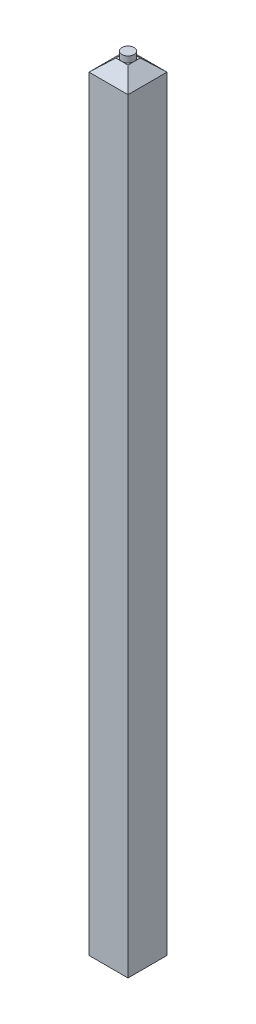
ISO-10303-21;
HEADER;
FILE_DESCRIPTION(('STEP AP214'),'2;1');
FILE_NAME('part.step','',(''),(''),'','','');
FILE_SCHEMA(('AUTOMOTIVE_DESIGN { 1 0 10303 214 1 1 1 1 }'));
ENDSEC;
DATA;
#1=APPLICATION_CONTEXT('core data for automotive mechanical design processes');
#2=APPLICATION_PROTOCOL_DEFINITION('international standard','automotive_design',2000,#1);
#3=PRODUCT_CONTEXT('',#1,'mechanical');
#4=PRODUCT('Part','Part','',(#3));
#5=PRODUCT_RELATED_PRODUCT_CATEGORY('part','',(#4));
#6=PRODUCT_DEFINITION_FORMATION('','',#4);
#7=PRODUCT_DEFINITION_CONTEXT('part definition',#1,'design');
#8=PRODUCT_DEFINITION('design','',#6,#7);
#9=PRODUCT_DEFINITION_SHAPE('','',#8);
#10=(LENGTH_UNIT() NAMED_UNIT(*) SI_UNIT(.MILLI.,.METRE.));
#11=(NAMED_UNIT(*) PLANE_ANGLE_UNIT() SI_UNIT($,.RADIAN.));
#12=(NAMED_UNIT(*) SI_UNIT($,.STERADIAN.) SOLID_ANGLE_UNIT());
#13=UNCERTAINTY_MEASURE_WITH_UNIT(LENGTH_MEASURE(1.E-05),#10,'distance_accuracy_value','');
#14=(GEOMETRIC_REPRESENTATION_CONTEXT(3) GLOBAL_UNCERTAINTY_ASSIGNED_CONTEXT((#13)) GLOBAL_UNIT_ASSIGNED_CONTEXT((#10,
#11,#12)) REPRESENTATION_CONTEXT('',''));
#15=CARTESIAN_POINT('',(0.,0.,0.));
#16=DIRECTION('',(0.,0.,1.));
#17=DIRECTION('',(1.,0.,0.));
#18=AXIS2_PLACEMENT_3D('',#15,#16,#17);
#19=CARTESIAN_POINT('',(0.,12.74,0.));
#20=DIRECTION('',(0.,-1.,0.));
#21=DIRECTION('',(0.,0.,-1.));
#22=AXIS2_PLACEMENT_3D('',#19,#20,#21);
#23=PLANE('',#22);
#24=CARTESIAN_POINT('',(0.,12.74,0.));
#25=DIRECTION('',(0.,1.,0.));
#26=DIRECTION('',(0.,0.,1.));
#27=AXIS2_PLACEMENT_3D('',#24,#25,#26);
#28=CIRCLE('',#27,0.1);
#29=CARTESIAN_POINT('',(0.,12.74,0.1));
#30=VERTEX_POINT('',#29);
#31=CARTESIAN_POINT('',(0.0999999999999997,12.74,0.));
#32=VERTEX_POINT('',#31);
#33=EDGE_CURVE('E163',#30,#32,#28,.T.);
#34=ORIENTED_EDGE('',*,*,#33,.F.);
#35=DIRECTION('',(1.,0.,0.));
#36=VECTOR('',#35,1.);
#37=CARTESIAN_POINT('',(0.1,12.74,0.1));
#38=LINE('',#37,#36);
#39=CARTESIAN_POINT('',(0.1,12.74,0.1));
#40=VERTEX_POINT('',#39);
#41=EDGE_CURVE('E143',#30,#40,#38,.T.);
#42=ORIENTED_EDGE('',*,*,#41,.T.);
#43=DIRECTION('',(0.,0.,-1.));
#44=VECTOR('',#43,1.);
#45=CARTESIAN_POINT('',(0.1,12.74,-0.1));
#46=LINE('',#45,#44);
#47=EDGE_CURVE('E55',#40,#32,#46,.T.);
#48=ORIENTED_EDGE('',*,*,#47,.T.);
#49=EDGE_LOOP('',(#34,#42,#48));
#50=FACE_BOUND('',#49,.T.);
#51=ADVANCED_FACE('F51',(#50),#23,.F.);
#52=CARTESIAN_POINT('',(0.,12.74,-0.1));
#53=VERTEX_POINT('',#52);
#54=EDGE_CURVE('E12',#32,#53,#28,.T.);
#55=ORIENTED_EDGE('',*,*,#54,.F.);
#56=CARTESIAN_POINT('',(0.1,12.74,-0.1));
#57=VERTEX_POINT('',#56);
#58=EDGE_CURVE('E142',#32,#57,#46,.T.);
#59=ORIENTED_EDGE('',*,*,#58,.T.);
#60=DIRECTION('',(-1.,0.,0.));
#61=VECTOR('',#60,1.);
#62=CARTESIAN_POINT('',(0.1,12.74,-0.1));
#63=LINE('',#62,#61);
#64=EDGE_CURVE('E275',#57,#53,#63,.T.);
#65=ORIENTED_EDGE('',*,*,#64,.T.);
#66=EDGE_LOOP('',(#55,#59,#65));
#67=FACE_BOUND('',#66,.T.);
#68=ADVANCED_FACE('F414',(#67),#23,.F.);
#69=CARTESIAN_POINT('',(-0.1,12.74,0.));
#70=VERTEX_POINT('',#69);
#71=EDGE_CURVE('E61',#53,#70,#28,.T.);
#72=ORIENTED_EDGE('',*,*,#71,.F.);
#73=CARTESIAN_POINT('',(-0.1,12.74,-0.1));
#74=VERTEX_POINT('',#73);
#75=EDGE_CURVE('E271',#53,#74,#63,.T.);
#76=ORIENTED_EDGE('',*,*,#75,.T.);
#77=DIRECTION('',(0.,0.,1.));
#78=VECTOR('',#77,1.);
#79=CARTESIAN_POINT('',(-0.1,12.74,-0.1));
#80=LINE('',#79,#78);
#81=EDGE_CURVE('E158',#74,#70,#80,.T.);
#82=ORIENTED_EDGE('',*,*,#81,.T.);
#83=EDGE_LOOP('',(#72,#76,#82));
#84=FACE_BOUND('',#83,.T.);
#85=ADVANCED_FACE('F205',(#84),#23,.F.);
#86=CARTESIAN_POINT('',(0.32,12.54,-0.32));
#87=DIRECTION('',(-1.,0.,0.));
#88=DIRECTION('',(0.,0.,1.));
#89=AXIS2_PLACEMENT_3D('',#86,#87,#88);
#90=PLANE('',#89);
#91=DIRECTION('',(0.,0.,1.));
#92=VECTOR('',#91,1.);
#93=CARTESIAN_POINT('',(0.32,0.,-0.32));
#94=LINE('',#93,#92);
#95=CARTESIAN_POINT('',(0.32,0.,0.32));
#96=VERTEX_POINT('',#95);
#97=CARTESIAN_POINT('',(0.32,0.,-0.32));
#98=VERTEX_POINT('',#97);
#99=EDGE_CURVE('E434',#96,#98,#94,.F.);
#100=ORIENTED_EDGE('',*,*,#99,.T.);
#101=DIRECTION('',(0.,-1.,0.));
#102=VECTOR('',#101,1.);
#103=CARTESIAN_POINT('',(0.32,12.54,-0.32));
#104=LINE('',#103,#102);
#105=CARTESIAN_POINT('',(0.32,12.54,-0.320000000000001));
#106=VERTEX_POINT('',#105);
#107=EDGE_CURVE('E169',#106,#98,#104,.T.);
#108=ORIENTED_EDGE('',*,*,#107,.F.);
#109=DIRECTION('',(0.,0.,1.));
#110=VECTOR('',#109,1.);
#111=CARTESIAN_POINT('',(0.319999999999999,12.54,0.));
#112=LINE('',#111,#110);
#113=CARTESIAN_POINT('',(0.32,12.54,0.32));
#114=VERTEX_POINT('',#113);
#115=EDGE_CURVE('E446',#114,#106,#112,.F.);
#116=ORIENTED_EDGE('',*,*,#115,.F.);
#117=DIRECTION('',(0.,-1.,0.));
#118=VECTOR('',#117,1.);
#119=CARTESIAN_POINT('',(0.32,12.54,0.32));
#120=LINE('',#119,#118);
#121=EDGE_CURVE('E436',#114,#96,#120,.T.);
#122=ORIENTED_EDGE('',*,*,#121,.T.);
#123=EDGE_LOOP('',(#100,#108,#116,#122));
#124=FACE_BOUND('',#123,.T.);
#125=ADVANCED_FACE('F53',(#124),#90,.F.);
#126=CARTESIAN_POINT('',(-0.32,12.54,-0.32));
#127=DIRECTION('',(0.,0.,1.));
#128=DIRECTION('',(1.,0.,0.));
#129=AXIS2_PLACEMENT_3D('',#126,#127,#128);
#130=PLANE('',#129);
#131=DIRECTION('',(1.,0.,0.));
#132=VECTOR('',#131,1.);
#133=CARTESIAN_POINT('',(-0.32,0.,-0.32));
#134=LINE('',#133,#132);
#135=CARTESIAN_POINT('',(-0.32,0.,-0.32));
#136=VERTEX_POINT('',#135);
#137=EDGE_CURVE('E375',#98,#136,#134,.F.);
#138=ORIENTED_EDGE('',*,*,#137,.T.);
#139=DIRECTION('',(0.,-1.,0.));
#140=VECTOR('',#139,1.);
#141=CARTESIAN_POINT('',(-0.32,12.54,-0.32));
#142=LINE('',#141,#140);
#143=CARTESIAN_POINT('',(-0.32,12.54,-0.32));
#144=VERTEX_POINT('',#143);
#145=EDGE_CURVE('E173',#144,#136,#142,.T.);
#146=ORIENTED_EDGE('',*,*,#145,.F.);
#147=DIRECTION('',(1.,0.,0.));
#148=VECTOR('',#147,1.);
#149=CARTESIAN_POINT('',(0.,12.54,-0.320000000000001));
#150=LINE('',#149,#148);
#151=EDGE_CURVE('E284',#106,#144,#150,.F.);
#152=ORIENTED_EDGE('',*,*,#151,.F.);
#153=ORIENTED_EDGE('',*,*,#107,.T.);
#154=EDGE_LOOP('',(#138,#146,#152,#153));
#155=FACE_BOUND('',#154,.T.);
#156=ADVANCED_FACE('F425',(#155),#130,.F.);
#157=CARTESIAN_POINT('',(-0.32,12.54,-0.32));
#158=DIRECTION('',(1.,0.,0.));
#159=DIRECTION('',(0.,0.,-1.));
#160=AXIS2_PLACEMENT_3D('',#157,#158,#159);
#161=PLANE('',#160);
#162=DIRECTION('',(0.,0.,-1.));
#163=VECTOR('',#162,1.);
#164=CARTESIAN_POINT('',(-0.32,0.,-0.32));
#165=LINE('',#164,#163);
#166=CARTESIAN_POINT('',(-0.32,0.,0.32));
#167=VERTEX_POINT('',#166);
#168=EDGE_CURVE('E437',#136,#167,#165,.F.);
#169=ORIENTED_EDGE('',*,*,#168,.T.);
#170=DIRECTION('',(0.,-1.,0.));
#171=VECTOR('',#170,1.);
#172=CARTESIAN_POINT('',(-0.32,12.54,0.32));
#173=LINE('',#172,#171);
#174=CARTESIAN_POINT('',(-0.32,12.54,0.32));
#175=VERTEX_POINT('',#174);
#176=EDGE_CURVE('E449',#175,#167,#173,.T.);
#177=ORIENTED_EDGE('',*,*,#176,.F.);
#178=DIRECTION('',(0.,0.,1.));
#179=VECTOR('',#178,1.);
#180=CARTESIAN_POINT('',(-0.320000000000001,12.54,0.));
#181=LINE('',#180,#179);
#182=EDGE_CURVE('E457',#144,#175,#181,.T.);
#183=ORIENTED_EDGE('',*,*,#182,.F.);
#184=ORIENTED_EDGE('',*,*,#145,.T.);
#185=EDGE_LOOP('',(#169,#177,#183,#184));
#186=FACE_BOUND('',#185,.T.);
#187=ADVANCED_FACE('F430',(#186),#161,.F.);
#188=CARTESIAN_POINT('',(-0.32,12.54,0.32));
#189=DIRECTION('',(0.,0.,-1.));
#190=DIRECTION('',(-1.,0.,0.));
#191=AXIS2_PLACEMENT_3D('',#188,#189,#190);
#192=PLANE('',#191);
#193=DIRECTION('',(-1.,0.,0.));
#194=VECTOR('',#193,1.);
#195=CARTESIAN_POINT('',(-0.32,0.,0.32));
#196=LINE('',#195,#194);
#197=EDGE_CURVE('E443',#167,#96,#196,.F.);
#198=ORIENTED_EDGE('',*,*,#197,.T.);
#199=ORIENTED_EDGE('',*,*,#121,.F.);
#200=DIRECTION('',(1.,0.,0.));
#201=VECTOR('',#200,1.);
#202=CARTESIAN_POINT('',(0.,12.54,0.319999999999999));
#203=LINE('',#202,#201);
#204=EDGE_CURVE('E452',#175,#114,#203,.T.);
#205=ORIENTED_EDGE('',*,*,#204,.F.);
#206=ORIENTED_EDGE('',*,*,#176,.T.);
#207=EDGE_LOOP('',(#198,#199,#205,#206));
#208=FACE_BOUND('',#207,.T.);
#209=ADVANCED_FACE('F204',(#208),#192,.F.);
#210=EDGE_CURVE('E134',#70,#30,#28,.T.);
#211=ORIENTED_EDGE('',*,*,#210,.F.);
#212=CARTESIAN_POINT('',(-0.1,12.74,0.1));
#213=VERTEX_POINT('',#212);
#214=EDGE_CURVE('E136',#70,#213,#80,.T.);
#215=ORIENTED_EDGE('',*,*,#214,.T.);
#216=EDGE_CURVE('E129',#213,#30,#38,.T.);
#217=ORIENTED_EDGE('',*,*,#216,.T.);
#218=EDGE_LOOP('',(#211,#215,#217));
#219=FACE_BOUND('',#218,.T.);
#220=ADVANCED_FACE('F132',(#219),#23,.F.);
#221=CARTESIAN_POINT('',(0.,7.02506787330315,-6.38642533936652));
#222=DIRECTION('',(0.,0.739940073395943,-0.672672793996314));
#223=DIRECTION('',(0.,0.672672793996314,0.739940073395943));
#224=AXIS2_PLACEMENT_3D('',#221,#222,#223);
#225=PLANE('',#224);
#226=DIRECTION('',(0.594811877479462,-0.540738070435876,-0.594811877479462));
#227=VECTOR('',#226,1.);
#228=CARTESIAN_POINT('',(0.1,12.74,-0.1));
#229=LINE('',#228,#227);
#230=EDGE_CURVE('E285',#57,#106,#229,.T.);
#231=ORIENTED_EDGE('',*,*,#230,.T.);
#232=ORIENTED_EDGE('',*,*,#151,.T.);
#233=DIRECTION('',(-0.594811877479462,-0.540738070435876,-0.594811877479462));
#234=VECTOR('',#233,1.);
#235=CARTESIAN_POINT('',(-0.1,12.74,-0.1));
#236=LINE('',#235,#234);
#237=EDGE_CURVE('E279',#74,#144,#236,.T.);
#238=ORIENTED_EDGE('',*,*,#237,.F.);
#239=ORIENTED_EDGE('',*,*,#75,.F.);
#240=ORIENTED_EDGE('',*,*,#64,.F.);
#241=EDGE_LOOP('',(#231,#232,#238,#239,#240));
#242=FACE_BOUND('',#241,.T.);
#243=ADVANCED_FACE('F203',(#242),#225,.T.);
#244=CARTESIAN_POINT('',(-6.38642533936652,7.02506787330315,0.));
#245=DIRECTION('',(-0.672672793996314,0.739940073395943,0.));
#246=DIRECTION('',(-0.739940073395943,-0.672672793996314,0.));
#247=AXIS2_PLACEMENT_3D('',#244,#245,#246);
#248=PLANE('',#247);
#249=ORIENTED_EDGE('',*,*,#237,.T.);
#250=ORIENTED_EDGE('',*,*,#182,.T.);
#251=DIRECTION('',(-0.594811877479462,-0.540738070435876,0.594811877479462));
#252=VECTOR('',#251,1.);
#253=CARTESIAN_POINT('',(-0.1,12.74,0.1));
#254=LINE('',#253,#252);
#255=EDGE_CURVE('E362',#213,#175,#254,.T.);
#256=ORIENTED_EDGE('',*,*,#255,.F.);
#257=ORIENTED_EDGE('',*,*,#214,.F.);
#258=ORIENTED_EDGE('',*,*,#81,.F.);
#259=EDGE_LOOP('',(#249,#250,#256,#257,#258));
#260=FACE_BOUND('',#259,.T.);
#261=ADVANCED_FACE('F240',(#260),#248,.T.);
#262=CARTESIAN_POINT('',(6.38642533936652,7.02506787330315,0.));
#263=DIRECTION('',(0.672672793996313,0.739940073395943,0.));
#264=DIRECTION('',(-0.739940073395943,0.672672793996313,0.));
#265=AXIS2_PLACEMENT_3D('',#262,#263,#264);
#266=PLANE('',#265);
#267=DIRECTION('',(0.594811877479462,-0.540738070435876,0.594811877479462));
#268=VECTOR('',#267,1.);
#269=CARTESIAN_POINT('',(0.1,12.74,0.1));
#270=LINE('',#269,#268);
#271=EDGE_CURVE('E153',#40,#114,#270,.T.);
#272=ORIENTED_EDGE('',*,*,#271,.T.);
#273=ORIENTED_EDGE('',*,*,#115,.T.);
#274=ORIENTED_EDGE('',*,*,#230,.F.);
#275=ORIENTED_EDGE('',*,*,#58,.F.);
#276=ORIENTED_EDGE('',*,*,#47,.F.);
#277=EDGE_LOOP('',(#272,#273,#274,#275,#276));
#278=FACE_BOUND('',#277,.T.);
#279=ADVANCED_FACE('F249',(#278),#266,.T.);
#280=CARTESIAN_POINT('',(0.,7.02506787330315,6.38642533936652));
#281=DIRECTION('',(0.,0.739940073395943,0.672672793996313));
#282=DIRECTION('',(0.,-0.672672793996313,0.739940073395943));
#283=AXIS2_PLACEMENT_3D('',#280,#281,#282);
#284=PLANE('',#283);
#285=ORIENTED_EDGE('',*,*,#255,.T.);
#286=ORIENTED_EDGE('',*,*,#204,.T.);
#287=ORIENTED_EDGE('',*,*,#271,.F.);
#288=ORIENTED_EDGE('',*,*,#41,.F.);
#289=ORIENTED_EDGE('',*,*,#216,.F.);
#290=EDGE_LOOP('',(#285,#286,#287,#288,#289));
#291=FACE_BOUND('',#290,.T.);
#292=ADVANCED_FACE('F150',(#291),#284,.T.);
#293=CARTESIAN_POINT('',(0.,-0.2,0.));
#294=DIRECTION('',(0.,1.,0.));
#295=DIRECTION('',(0.,0.,1.));
#296=AXIS2_PLACEMENT_3D('',#293,#294,#295);
#297=PLANE('',#296);
#298=DIRECTION('',(0.,0.,1.));
#299=VECTOR('',#298,1.);
#300=CARTESIAN_POINT('',(0.1,-0.2,-0.1));
#301=LINE('',#300,#299);
#302=CARTESIAN_POINT('',(0.1,-0.2,-0.1));
#303=VERTEX_POINT('',#302);
#304=CARTESIAN_POINT('',(0.1,-0.2,0.1));
#305=VERTEX_POINT('',#304);
#306=EDGE_CURVE('E348',#303,#305,#301,.T.);
#307=ORIENTED_EDGE('',*,*,#306,.T.);
#308=DIRECTION('',(-1.,0.,0.));
#309=VECTOR('',#308,1.);
#310=CARTESIAN_POINT('',(-0.1,-0.2,0.1));
#311=LINE('',#310,#309);
#312=CARTESIAN_POINT('',(-0.1,-0.2,0.1));
#313=VERTEX_POINT('',#312);
#314=EDGE_CURVE('E341',#305,#313,#311,.T.);
#315=ORIENTED_EDGE('',*,*,#314,.T.);
#316=DIRECTION('',(0.,0.,-1.));
#317=VECTOR('',#316,1.);
#318=CARTESIAN_POINT('',(-0.1,-0.2,-0.1));
#319=LINE('',#318,#317);
#320=CARTESIAN_POINT('',(-0.1,-0.2,-0.1));
#321=VERTEX_POINT('',#320);
#322=EDGE_CURVE('E347',#313,#321,#319,.T.);
#323=ORIENTED_EDGE('',*,*,#322,.T.);
#324=DIRECTION('',(1.,0.,0.));
#325=VECTOR('',#324,1.);
#326=CARTESIAN_POINT('',(-0.1,-0.2,-0.1));
#327=LINE('',#326,#325);
#328=EDGE_CURVE('E352',#321,#303,#327,.T.);
#329=ORIENTED_EDGE('',*,*,#328,.T.);
#330=EDGE_LOOP('',(#307,#315,#323,#329));
#331=FACE_BOUND('',#330,.T.);
#332=ADVANCED_FACE('F307',(#331),#297,.F.);
#333=CARTESIAN_POINT('',(0.,-0.159276018099548,0.144796380090498));
#334=DIRECTION('',(0.,-0.739940073395944,0.672672793996312));
#335=DIRECTION('',(0.,-0.672672793996312,-0.739940073395944));
#336=AXIS2_PLACEMENT_3D('',#333,#334,#335);
#337=PLANE('',#336);
#338=DIRECTION('',(0.594811877479463,0.540738070435875,0.594811877479463));
#339=VECTOR('',#338,1.);
#340=CARTESIAN_POINT('',(0.1,-0.2,0.1));
#341=LINE('',#340,#339);
#342=EDGE_CURVE('E371',#305,#96,#341,.T.);
#343=ORIENTED_EDGE('',*,*,#342,.T.);
#344=ORIENTED_EDGE('',*,*,#197,.F.);
#345=DIRECTION('',(-0.594811877479462,0.540738070435875,0.594811877479463));
#346=VECTOR('',#345,1.);
#347=CARTESIAN_POINT('',(-0.1,-0.2,0.1));
#348=LINE('',#347,#346);
#349=EDGE_CURVE('E372',#313,#167,#348,.T.);
#350=ORIENTED_EDGE('',*,*,#349,.F.);
#351=ORIENTED_EDGE('',*,*,#314,.F.);
#352=EDGE_LOOP('',(#343,#344,#350,#351));
#353=FACE_BOUND('',#352,.T.);
#354=ADVANCED_FACE('F317',(#353),#337,.T.);
#355=CARTESIAN_POINT('',(-0.144796380090498,-0.159276018099547,0.));
#356=DIRECTION('',(-0.672672793996313,-0.739940073395944,0.));
#357=DIRECTION('',(0.739940073395944,-0.672672793996313,0.));
#358=AXIS2_PLACEMENT_3D('',#355,#356,#357);
#359=PLANE('',#358);
#360=ORIENTED_EDGE('',*,*,#349,.T.);
#361=ORIENTED_EDGE('',*,*,#168,.F.);
#362=DIRECTION('',(-0.594811877479463,0.540738070435875,-0.594811877479463));
#363=VECTOR('',#362,1.);
#364=CARTESIAN_POINT('',(-0.1,-0.2,-0.1));
#365=LINE('',#364,#363);
#366=EDGE_CURVE('E376',#321,#136,#365,.T.);
#367=ORIENTED_EDGE('',*,*,#366,.F.);
#368=ORIENTED_EDGE('',*,*,#322,.F.);
#369=EDGE_LOOP('',(#360,#361,#367,#368));
#370=FACE_BOUND('',#369,.T.);
#371=ADVANCED_FACE('F393',(#370),#359,.T.);
#372=CARTESIAN_POINT('',(0.144796380090498,-0.159276018099548,0.));
#373=DIRECTION('',(0.672672793996312,-0.739940073395944,0.));
#374=DIRECTION('',(0.739940073395944,0.672672793996313,0.));
#375=AXIS2_PLACEMENT_3D('',#372,#373,#374);
#376=PLANE('',#375);
#377=DIRECTION('',(0.594811877479463,0.540738070435875,-0.594811877479463));
#378=VECTOR('',#377,1.);
#379=CARTESIAN_POINT('',(0.1,-0.2,-0.1));
#380=LINE('',#379,#378);
#381=EDGE_CURVE('E368',#303,#98,#380,.T.);
#382=ORIENTED_EDGE('',*,*,#381,.T.);
#383=ORIENTED_EDGE('',*,*,#99,.F.);
#384=ORIENTED_EDGE('',*,*,#342,.F.);
#385=ORIENTED_EDGE('',*,*,#306,.F.);
#386=EDGE_LOOP('',(#382,#383,#384,#385));
#387=FACE_BOUND('',#386,.T.);
#388=ADVANCED_FACE('F367',(#387),#376,.T.);
#389=CARTESIAN_POINT('',(0.,-0.159276018099548,-0.144796380090498));
#390=DIRECTION('',(0.,-0.739940073395944,-0.672672793996313));
#391=DIRECTION('',(0.,0.672672793996313,-0.739940073395944));
#392=AXIS2_PLACEMENT_3D('',#389,#390,#391);
#393=PLANE('',#392);
#394=ORIENTED_EDGE('',*,*,#366,.T.);
#395=ORIENTED_EDGE('',*,*,#137,.F.);
#396=ORIENTED_EDGE('',*,*,#381,.F.);
#397=ORIENTED_EDGE('',*,*,#328,.F.);
#398=EDGE_LOOP('',(#394,#395,#396,#397));
#399=FACE_BOUND('',#398,.T.);
#400=ADVANCED_FACE('F206',(#399),#393,.T.);
#401=CARTESIAN_POINT('',(0.,12.84,0.));
#402=DIRECTION('',(0.,-1.,0.));
#403=DIRECTION('',(0.,0.,-1.));
#404=AXIS2_PLACEMENT_3D('',#401,#402,#403);
#405=CYLINDRICAL_SURFACE('',#404,0.1);
#406=CARTESIAN_POINT('',(0.,12.84,0.));
#407=DIRECTION('',(0.,1.,0.));
#408=DIRECTION('',(0.,0.,1.));
#409=AXIS2_PLACEMENT_3D('',#406,#407,#408);
#410=CIRCLE('',#409,0.1);
#411=CARTESIAN_POINT('',(0.,12.84,0.1));
#412=VERTEX_POINT('',#411);
#413=EDGE_CURVE('E166',#412,#412,#410,.T.);
#414=ORIENTED_EDGE('',*,*,#413,.F.);
#415=EDGE_LOOP('',(#414));
#416=FACE_BOUND('',#415,.T.);
#417=ORIENTED_EDGE('',*,*,#33,.T.);
#418=ORIENTED_EDGE('',*,*,#54,.T.);
#419=ORIENTED_EDGE('',*,*,#71,.T.);
#420=ORIENTED_EDGE('',*,*,#210,.T.);
#421=EDGE_LOOP('',(#417,#418,#419,#420));
#422=FACE_BOUND('',#421,.T.);
#423=ADVANCED_FACE('F168',(#416,#422),#405,.T.);
#424=CARTESIAN_POINT('',(0.,12.84,0.));
#425=DIRECTION('',(0.,1.,0.));
#426=DIRECTION('',(0.,0.,1.));
#427=AXIS2_PLACEMENT_3D('',#424,#425,#426);
#428=PLANE('',#427);
#429=ORIENTED_EDGE('',*,*,#413,.T.);
#430=EDGE_LOOP('',(#429));
#431=FACE_BOUND('',#430,.T.);
#432=ADVANCED_FACE('F569',(#431),#428,.T.);
#433=CLOSED_SHELL('',(#51,#68,#85,#125,#156,#187,#209,#220,#243,#261,#279,#292,#332,#354,#371,
#388,#400,#423,#432));
#434=MANIFOLD_SOLID_BREP('B2',#433);
#435=ADVANCED_BREP_SHAPE_REPRESENTATION('',(#18,#434),#14);
#436=SHAPE_DEFINITION_REPRESENTATION(#9,#435);
ENDSEC;
END-ISO-10303-21;
